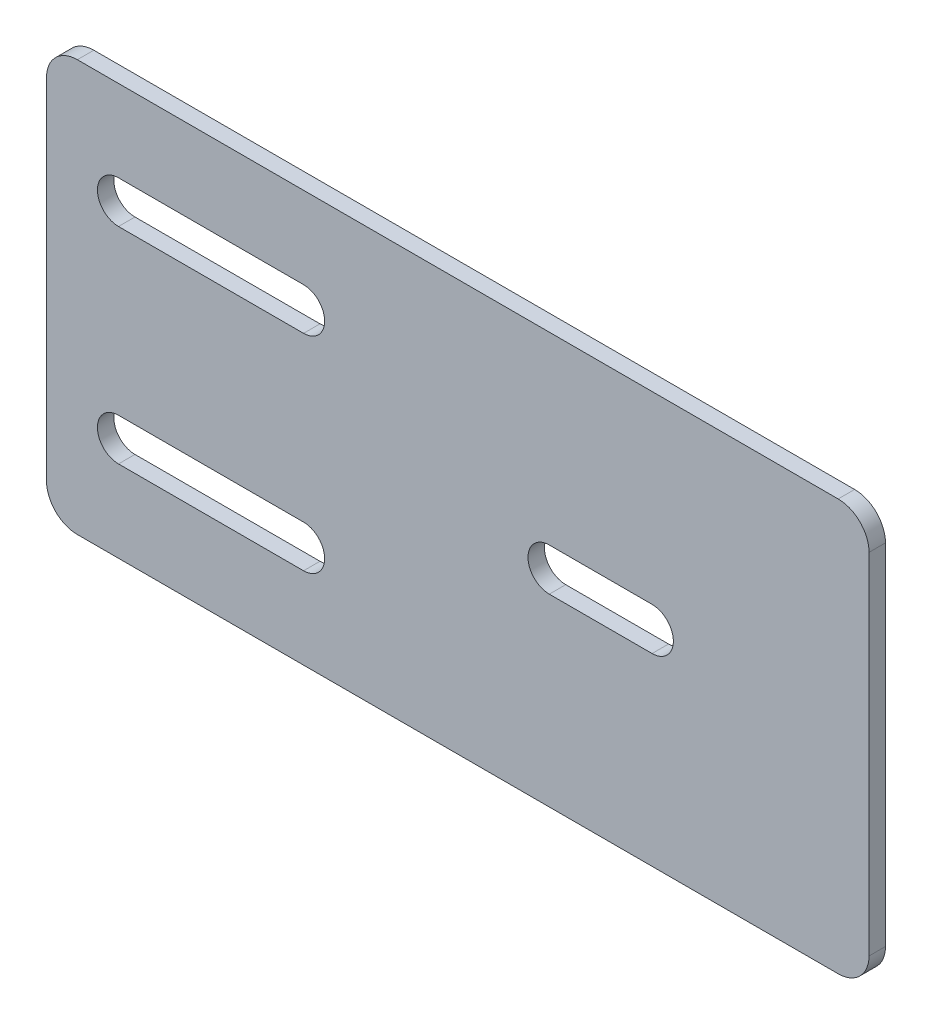
ISO-10303-21;
HEADER;
FILE_DESCRIPTION(('STEP AP214'),'2;1');
FILE_NAME('part.step','',(''),(''),'','','');
FILE_SCHEMA(('AUTOMOTIVE_DESIGN { 1 0 10303 214 1 1 1 1 }'));
ENDSEC;
DATA;
#1=APPLICATION_CONTEXT('core data for automotive mechanical design processes');
#2=APPLICATION_PROTOCOL_DEFINITION('international standard','automotive_design',2000,#1);
#3=PRODUCT_CONTEXT('',#1,'mechanical');
#4=PRODUCT('Part','Part','',(#3));
#5=PRODUCT_RELATED_PRODUCT_CATEGORY('part','',(#4));
#6=PRODUCT_DEFINITION_FORMATION('','',#4);
#7=PRODUCT_DEFINITION_CONTEXT('part definition',#1,'design');
#8=PRODUCT_DEFINITION('design','',#6,#7);
#9=PRODUCT_DEFINITION_SHAPE('','',#8);
#10=(LENGTH_UNIT() NAMED_UNIT(*) SI_UNIT(.MILLI.,.METRE.));
#11=(NAMED_UNIT(*) PLANE_ANGLE_UNIT() SI_UNIT($,.RADIAN.));
#12=(NAMED_UNIT(*) SI_UNIT($,.STERADIAN.) SOLID_ANGLE_UNIT());
#13=UNCERTAINTY_MEASURE_WITH_UNIT(LENGTH_MEASURE(1.E-05),#10,'distance_accuracy_value','');
#14=(GEOMETRIC_REPRESENTATION_CONTEXT(3) GLOBAL_UNCERTAINTY_ASSIGNED_CONTEXT((#13)) GLOBAL_UNIT_ASSIGNED_CONTEXT((#10,
#11,#12)) REPRESENTATION_CONTEXT('',''));
#15=CARTESIAN_POINT('',(0.,0.,0.));
#16=DIRECTION('',(0.,0.,1.));
#17=DIRECTION('',(1.,0.,0.));
#18=AXIS2_PLACEMENT_3D('',#15,#16,#17);
#19=CARTESIAN_POINT('',(0.,0.,1.6));
#20=DIRECTION('',(0.,0.,1.));
#21=DIRECTION('',(1.,0.,0.));
#22=AXIS2_PLACEMENT_3D('',#19,#20,#21);
#23=PLANE('',#22);
#24=DIRECTION('',(1.,0.,0.));
#25=VECTOR('',#24,1.);
#26=CARTESIAN_POINT('',(-40.,-20.,1.6));
#27=LINE('',#26,#25);
#28=CARTESIAN_POINT('',(-37.,-20.,1.6));
#29=VERTEX_POINT('',#28);
#30=CARTESIAN_POINT('',(37.,-20.,1.6));
#31=VERTEX_POINT('',#30);
#32=EDGE_CURVE('E335',#29,#31,#27,.T.);
#33=ORIENTED_EDGE('',*,*,#32,.T.);
#34=CARTESIAN_POINT('',(37.,-17.,1.6));
#35=DIRECTION('',(0.,0.,1.));
#36=DIRECTION('',(1.,0.,0.));
#37=AXIS2_PLACEMENT_3D('',#34,#35,#36);
#38=CIRCLE('',#37,3.);
#39=CARTESIAN_POINT('',(40.,-17.,1.6));
#40=VERTEX_POINT('',#39);
#41=EDGE_CURVE('E328',#31,#40,#38,.T.);
#42=ORIENTED_EDGE('',*,*,#41,.T.);
#43=DIRECTION('',(0.,1.,0.));
#44=VECTOR('',#43,1.);
#45=CARTESIAN_POINT('',(40.,20.,1.6));
#46=LINE('',#45,#44);
#47=CARTESIAN_POINT('',(40.,17.,1.6));
#48=VERTEX_POINT('',#47);
#49=EDGE_CURVE('E304',#40,#48,#46,.T.);
#50=ORIENTED_EDGE('',*,*,#49,.T.);
#51=CARTESIAN_POINT('',(37.,17.,1.6));
#52=DIRECTION('',(0.,0.,1.));
#53=DIRECTION('',(1.,0.,0.));
#54=AXIS2_PLACEMENT_3D('',#51,#52,#53);
#55=CIRCLE('',#54,3.);
#56=CARTESIAN_POINT('',(37.,20.,1.6));
#57=VERTEX_POINT('',#56);
#58=EDGE_CURVE('E320',#48,#57,#55,.T.);
#59=ORIENTED_EDGE('',*,*,#58,.T.);
#60=DIRECTION('',(-1.,0.,0.));
#61=VECTOR('',#60,1.);
#62=CARTESIAN_POINT('',(-40.,20.,1.6));
#63=LINE('',#62,#61);
#64=CARTESIAN_POINT('',(-37.,20.,1.6));
#65=VERTEX_POINT('',#64);
#66=EDGE_CURVE('E308',#57,#65,#63,.T.);
#67=ORIENTED_EDGE('',*,*,#66,.T.);
#68=CARTESIAN_POINT('',(-37.,17.,1.6));
#69=DIRECTION('',(0.,0.,1.));
#70=DIRECTION('',(1.,0.,0.));
#71=AXIS2_PLACEMENT_3D('',#68,#69,#70);
#72=CIRCLE('',#71,3.);
#73=CARTESIAN_POINT('',(-40.,17.,1.6));
#74=VERTEX_POINT('',#73);
#75=EDGE_CURVE('E63',#65,#74,#72,.T.);
#76=ORIENTED_EDGE('',*,*,#75,.T.);
#77=DIRECTION('',(0.,-1.,0.));
#78=VECTOR('',#77,1.);
#79=CARTESIAN_POINT('',(-40.,20.,1.6));
#80=LINE('',#79,#78);
#81=CARTESIAN_POINT('',(-40.,-17.,1.6));
#82=VERTEX_POINT('',#81);
#83=EDGE_CURVE('E332',#74,#82,#80,.T.);
#84=ORIENTED_EDGE('',*,*,#83,.T.);
#85=CARTESIAN_POINT('',(-37.,-17.,1.6));
#86=DIRECTION('',(0.,0.,1.));
#87=DIRECTION('',(1.,0.,0.));
#88=AXIS2_PLACEMENT_3D('',#85,#86,#87);
#89=CIRCLE('',#88,3.);
#90=EDGE_CURVE('E324',#82,#29,#89,.T.);
#91=ORIENTED_EDGE('',*,*,#90,.T.);
#92=EDGE_LOOP('',(#33,#42,#50,#59,#67,#76,#84,#91));
#93=FACE_BOUND('',#92,.T.);
#94=DIRECTION('',(-1.,0.,0.));
#95=VECTOR('',#94,1.);
#96=CARTESIAN_POINT('',(-15.,12.05,1.6));
#97=LINE('',#96,#95);
#98=CARTESIAN_POINT('',(-15.,12.05,1.6));
#99=VERTEX_POINT('',#98);
#100=CARTESIAN_POINT('',(-33.,12.05,1.6));
#101=VERTEX_POINT('',#100);
#102=EDGE_CURVE('E269',#99,#101,#97,.T.);
#103=ORIENTED_EDGE('',*,*,#102,.F.);
#104=CARTESIAN_POINT('',(-15.,10.,1.6));
#105=DIRECTION('',(0.,0.,1.));
#106=DIRECTION('',(1.,0.,0.));
#107=AXIS2_PLACEMENT_3D('',#104,#105,#106);
#108=CIRCLE('',#107,2.05);
#109=CARTESIAN_POINT('',(-15.,7.95,1.6));
#110=VERTEX_POINT('',#109);
#111=EDGE_CURVE('E266',#110,#99,#108,.T.);
#112=ORIENTED_EDGE('',*,*,#111,.F.);
#113=DIRECTION('',(1.,0.,0.));
#114=VECTOR('',#113,1.);
#115=CARTESIAN_POINT('',(-15.,7.95,1.6));
#116=LINE('',#115,#114);
#117=CARTESIAN_POINT('',(-33.,7.95,1.6));
#118=VERTEX_POINT('',#117);
#119=EDGE_CURVE('E278',#118,#110,#116,.T.);
#120=ORIENTED_EDGE('',*,*,#119,.F.);
#121=CARTESIAN_POINT('',(-33.,9.99999999999999,1.6));
#122=DIRECTION('',(0.,0.,1.));
#123=DIRECTION('',(1.,0.,0.));
#124=AXIS2_PLACEMENT_3D('',#121,#122,#123);
#125=CIRCLE('',#124,2.05);
#126=EDGE_CURVE('E282',#101,#118,#125,.T.);
#127=ORIENTED_EDGE('',*,*,#126,.F.);
#128=EDGE_LOOP('',(#103,#112,#120,#127));
#129=FACE_BOUND('',#128,.T.);
#130=DIRECTION('',(-1.,0.,0.));
#131=VECTOR('',#130,1.);
#132=CARTESIAN_POINT('',(-15.,-7.95,1.6));
#133=LINE('',#132,#131);
#134=CARTESIAN_POINT('',(-15.,-7.95,1.6));
#135=VERTEX_POINT('',#134);
#136=CARTESIAN_POINT('',(-33.,-7.95,1.6));
#137=VERTEX_POINT('',#136);
#138=EDGE_CURVE('E233',#135,#137,#133,.T.);
#139=ORIENTED_EDGE('',*,*,#138,.F.);
#140=CARTESIAN_POINT('',(-15.,-10.,1.6));
#141=DIRECTION('',(0.,0.,1.));
#142=DIRECTION('',(-1.,0.,0.));
#143=AXIS2_PLACEMENT_3D('',#140,#141,#142);
#144=CIRCLE('',#143,2.05);
#145=CARTESIAN_POINT('',(-15.,-12.05,1.6));
#146=VERTEX_POINT('',#145);
#147=EDGE_CURVE('E230',#146,#135,#144,.T.);
#148=ORIENTED_EDGE('',*,*,#147,.F.);
#149=DIRECTION('',(1.,0.,0.));
#150=VECTOR('',#149,1.);
#151=CARTESIAN_POINT('',(-15.,-12.05,1.6));
#152=LINE('',#151,#150);
#153=CARTESIAN_POINT('',(-33.,-12.05,1.6));
#154=VERTEX_POINT('',#153);
#155=EDGE_CURVE('E240',#154,#146,#152,.T.);
#156=ORIENTED_EDGE('',*,*,#155,.F.);
#157=CARTESIAN_POINT('',(-33.,-9.99999999999999,1.6));
#158=DIRECTION('',(0.,0.,1.));
#159=DIRECTION('',(-1.,0.,0.));
#160=AXIS2_PLACEMENT_3D('',#157,#158,#159);
#161=CIRCLE('',#160,2.05);
#162=EDGE_CURVE('E244',#137,#154,#161,.T.);
#163=ORIENTED_EDGE('',*,*,#162,.F.);
#164=EDGE_LOOP('',(#139,#148,#156,#163));
#165=FACE_BOUND('',#164,.T.);
#166=DIRECTION('',(1.,0.,0.));
#167=VECTOR('',#166,1.);
#168=CARTESIAN_POINT('',(8.9,-2.07,1.6));
#169=LINE('',#168,#167);
#170=CARTESIAN_POINT('',(8.9,-2.07,1.6));
#171=VERTEX_POINT('',#170);
#172=CARTESIAN_POINT('',(18.9,-2.07,1.6));
#173=VERTEX_POINT('',#172);
#174=EDGE_CURVE('E191',#171,#173,#169,.T.);
#175=ORIENTED_EDGE('',*,*,#174,.F.);
#176=CARTESIAN_POINT('',(8.9,0.,1.6));
#177=DIRECTION('',(0.,0.,1.));
#178=DIRECTION('',(1.,0.,0.));
#179=AXIS2_PLACEMENT_3D('',#176,#177,#178);
#180=CIRCLE('',#179,2.07);
#181=CARTESIAN_POINT('',(8.9,2.07,1.6));
#182=VERTEX_POINT('',#181);
#183=EDGE_CURVE('E181',#182,#171,#180,.T.);
#184=ORIENTED_EDGE('',*,*,#183,.F.);
#185=DIRECTION('',(-1.,0.,0.));
#186=VECTOR('',#185,1.);
#187=CARTESIAN_POINT('',(8.9,2.07,1.6));
#188=LINE('',#187,#186);
#189=CARTESIAN_POINT('',(18.9,2.07,1.6));
#190=VERTEX_POINT('',#189);
#191=EDGE_CURVE('E206',#190,#182,#188,.T.);
#192=ORIENTED_EDGE('',*,*,#191,.F.);
#193=CARTESIAN_POINT('',(18.9,0.,1.6));
#194=DIRECTION('',(0.,0.,1.));
#195=DIRECTION('',(1.,0.,0.));
#196=AXIS2_PLACEMENT_3D('',#193,#194,#195);
#197=CIRCLE('',#196,2.07);
#198=EDGE_CURVE('E204',#173,#190,#197,.T.);
#199=ORIENTED_EDGE('',*,*,#198,.F.);
#200=EDGE_LOOP('',(#175,#184,#192,#199));
#201=FACE_BOUND('',#200,.T.);
#202=ADVANCED_FACE('F41',(#93,#129,#165,#201),#23,.T.);
#203=CARTESIAN_POINT('',(0.,0.,0.));
#204=DIRECTION('',(0.,0.,1.));
#205=DIRECTION('',(1.,0.,0.));
#206=AXIS2_PLACEMENT_3D('',#203,#204,#205);
#207=PLANE('',#206);
#208=CARTESIAN_POINT('',(-15.,-10.,0.));
#209=DIRECTION('',(0.,0.,1.));
#210=DIRECTION('',(-1.,0.,0.));
#211=AXIS2_PLACEMENT_3D('',#208,#209,#210);
#212=CIRCLE('',#211,2.05);
#213=CARTESIAN_POINT('',(-15.,-12.05,0.));
#214=VERTEX_POINT('',#213);
#215=CARTESIAN_POINT('',(-15.,-7.95,0.));
#216=VERTEX_POINT('',#215);
#217=EDGE_CURVE('E199',#214,#216,#212,.T.);
#218=ORIENTED_EDGE('',*,*,#217,.T.);
#219=DIRECTION('',(-1.,0.,0.));
#220=VECTOR('',#219,1.);
#221=CARTESIAN_POINT('',(-15.,-7.95,0.));
#222=LINE('',#221,#220);
#223=CARTESIAN_POINT('',(-33.,-7.95,0.));
#224=VERTEX_POINT('',#223);
#225=EDGE_CURVE('E248',#216,#224,#222,.T.);
#226=ORIENTED_EDGE('',*,*,#225,.T.);
#227=CARTESIAN_POINT('',(-33.,-9.99999999999999,0.));
#228=DIRECTION('',(0.,0.,1.));
#229=DIRECTION('',(-1.,0.,0.));
#230=AXIS2_PLACEMENT_3D('',#227,#228,#229);
#231=CIRCLE('',#230,2.05);
#232=CARTESIAN_POINT('',(-33.,-12.05,0.));
#233=VERTEX_POINT('',#232);
#234=EDGE_CURVE('E251',#224,#233,#231,.T.);
#235=ORIENTED_EDGE('',*,*,#234,.T.);
#236=DIRECTION('',(1.,0.,0.));
#237=VECTOR('',#236,1.);
#238=CARTESIAN_POINT('',(-15.,-12.05,0.));
#239=LINE('',#238,#237);
#240=EDGE_CURVE('E234',#233,#214,#239,.T.);
#241=ORIENTED_EDGE('',*,*,#240,.T.);
#242=EDGE_LOOP('',(#218,#226,#235,#241));
#243=FACE_BOUND('',#242,.T.);
#244=DIRECTION('',(0.,1.,0.));
#245=VECTOR('',#244,1.);
#246=CARTESIAN_POINT('',(40.,20.,0.));
#247=LINE('',#246,#245);
#248=CARTESIAN_POINT('',(40.,-17.,0.));
#249=VERTEX_POINT('',#248);
#250=CARTESIAN_POINT('',(40.,17.,0.));
#251=VERTEX_POINT('',#250);
#252=EDGE_CURVE('E303',#249,#251,#247,.T.);
#253=ORIENTED_EDGE('',*,*,#252,.F.);
#254=CARTESIAN_POINT('',(37.,-17.,0.));
#255=DIRECTION('',(0.,0.,1.));
#256=DIRECTION('',(1.,0.,0.));
#257=AXIS2_PLACEMENT_3D('',#254,#255,#256);
#258=CIRCLE('',#257,3.);
#259=CARTESIAN_POINT('',(37.,-20.,0.));
#260=VERTEX_POINT('',#259);
#261=EDGE_CURVE('E359',#249,#260,#258,.F.);
#262=ORIENTED_EDGE('',*,*,#261,.T.);
#263=DIRECTION('',(1.,0.,0.));
#264=VECTOR('',#263,1.);
#265=CARTESIAN_POINT('',(-40.,-20.,0.));
#266=LINE('',#265,#264);
#267=CARTESIAN_POINT('',(-37.,-20.,0.));
#268=VERTEX_POINT('',#267);
#269=EDGE_CURVE('E309',#268,#260,#266,.T.);
#270=ORIENTED_EDGE('',*,*,#269,.F.);
#271=CARTESIAN_POINT('',(-37.,-17.,0.));
#272=DIRECTION('',(0.,0.,1.));
#273=DIRECTION('',(1.,0.,0.));
#274=AXIS2_PLACEMENT_3D('',#271,#272,#273);
#275=CIRCLE('',#274,3.);
#276=CARTESIAN_POINT('',(-40.,-17.,0.));
#277=VERTEX_POINT('',#276);
#278=EDGE_CURVE('E357',#268,#277,#275,.F.);
#279=ORIENTED_EDGE('',*,*,#278,.T.);
#280=DIRECTION('',(0.,-1.,0.));
#281=VECTOR('',#280,1.);
#282=CARTESIAN_POINT('',(-40.,20.,0.));
#283=LINE('',#282,#281);
#284=CARTESIAN_POINT('',(-40.,17.,0.));
#285=VERTEX_POINT('',#284);
#286=EDGE_CURVE('E345',#285,#277,#283,.T.);
#287=ORIENTED_EDGE('',*,*,#286,.F.);
#288=CARTESIAN_POINT('',(-37.,17.,0.));
#289=DIRECTION('',(0.,0.,1.));
#290=DIRECTION('',(1.,0.,0.));
#291=AXIS2_PLACEMENT_3D('',#288,#289,#290);
#292=CIRCLE('',#291,3.);
#293=CARTESIAN_POINT('',(-37.,20.,0.));
#294=VERTEX_POINT('',#293);
#295=EDGE_CURVE('E353',#285,#294,#292,.F.);
#296=ORIENTED_EDGE('',*,*,#295,.T.);
#297=DIRECTION('',(-1.,0.,0.));
#298=VECTOR('',#297,1.);
#299=CARTESIAN_POINT('',(-40.,20.,0.));
#300=LINE('',#299,#298);
#301=CARTESIAN_POINT('',(37.,20.,0.));
#302=VERTEX_POINT('',#301);
#303=EDGE_CURVE('E342',#302,#294,#300,.T.);
#304=ORIENTED_EDGE('',*,*,#303,.F.);
#305=CARTESIAN_POINT('',(37.,17.,0.));
#306=DIRECTION('',(0.,0.,1.));
#307=DIRECTION('',(1.,0.,0.));
#308=AXIS2_PLACEMENT_3D('',#305,#306,#307);
#309=CIRCLE('',#308,3.);
#310=EDGE_CURVE('E355',#302,#251,#309,.F.);
#311=ORIENTED_EDGE('',*,*,#310,.T.);
#312=EDGE_LOOP('',(#253,#262,#270,#279,#287,#296,#304,#311));
#313=FACE_BOUND('',#312,.T.);
#314=CARTESIAN_POINT('',(-15.,10.,0.));
#315=DIRECTION('',(0.,0.,1.));
#316=DIRECTION('',(1.,0.,0.));
#317=AXIS2_PLACEMENT_3D('',#314,#315,#316);
#318=CIRCLE('',#317,2.05);
#319=CARTESIAN_POINT('',(-15.,7.95,0.));
#320=VERTEX_POINT('',#319);
#321=CARTESIAN_POINT('',(-15.,12.05,0.));
#322=VERTEX_POINT('',#321);
#323=EDGE_CURVE('E265',#320,#322,#318,.T.);
#324=ORIENTED_EDGE('',*,*,#323,.T.);
#325=DIRECTION('',(-1.,0.,0.));
#326=VECTOR('',#325,1.);
#327=CARTESIAN_POINT('',(-15.,12.05,0.));
#328=LINE('',#327,#326);
#329=CARTESIAN_POINT('',(-33.,12.05,0.));
#330=VERTEX_POINT('',#329);
#331=EDGE_CURVE('E286',#322,#330,#328,.T.);
#332=ORIENTED_EDGE('',*,*,#331,.T.);
#333=CARTESIAN_POINT('',(-33.,9.99999999999999,0.));
#334=DIRECTION('',(0.,0.,1.));
#335=DIRECTION('',(1.,0.,0.));
#336=AXIS2_PLACEMENT_3D('',#333,#334,#335);
#337=CIRCLE('',#336,2.05);
#338=CARTESIAN_POINT('',(-33.,7.95,0.));
#339=VERTEX_POINT('',#338);
#340=EDGE_CURVE('E289',#330,#339,#337,.T.);
#341=ORIENTED_EDGE('',*,*,#340,.T.);
#342=DIRECTION('',(1.,0.,0.));
#343=VECTOR('',#342,1.);
#344=CARTESIAN_POINT('',(-15.,7.95,0.));
#345=LINE('',#344,#343);
#346=EDGE_CURVE('E270',#339,#320,#345,.T.);
#347=ORIENTED_EDGE('',*,*,#346,.T.);
#348=EDGE_LOOP('',(#324,#332,#341,#347));
#349=FACE_BOUND('',#348,.T.);
#350=CARTESIAN_POINT('',(8.9,0.,0.));
#351=DIRECTION('',(0.,0.,1.));
#352=DIRECTION('',(1.,0.,0.));
#353=AXIS2_PLACEMENT_3D('',#350,#351,#352);
#354=CIRCLE('',#353,2.07);
#355=CARTESIAN_POINT('',(8.9,2.07,0.));
#356=VERTEX_POINT('',#355);
#357=CARTESIAN_POINT('',(8.9,-2.07,0.));
#358=VERTEX_POINT('',#357);
#359=EDGE_CURVE('E218',#356,#358,#354,.T.);
#360=ORIENTED_EDGE('',*,*,#359,.T.);
#361=DIRECTION('',(1.,0.,0.));
#362=VECTOR('',#361,1.);
#363=CARTESIAN_POINT('',(8.9,-2.07,0.));
#364=LINE('',#363,#362);
#365=CARTESIAN_POINT('',(18.9,-2.07,0.));
#366=VERTEX_POINT('',#365);
#367=EDGE_CURVE('E198',#358,#366,#364,.T.);
#368=ORIENTED_EDGE('',*,*,#367,.T.);
#369=CARTESIAN_POINT('',(18.9,0.,0.));
#370=DIRECTION('',(0.,0.,1.));
#371=DIRECTION('',(1.,0.,0.));
#372=AXIS2_PLACEMENT_3D('',#369,#370,#371);
#373=CIRCLE('',#372,2.07);
#374=CARTESIAN_POINT('',(18.9,2.07,0.));
#375=VERTEX_POINT('',#374);
#376=EDGE_CURVE('E221',#366,#375,#373,.T.);
#377=ORIENTED_EDGE('',*,*,#376,.T.);
#378=DIRECTION('',(-1.,0.,0.));
#379=VECTOR('',#378,1.);
#380=CARTESIAN_POINT('',(8.9,2.07,0.));
#381=LINE('',#380,#379);
#382=EDGE_CURVE('E192',#375,#356,#381,.T.);
#383=ORIENTED_EDGE('',*,*,#382,.T.);
#384=EDGE_LOOP('',(#360,#368,#377,#383));
#385=FACE_BOUND('',#384,.T.);
#386=ADVANCED_FACE('F392',(#243,#313,#349,#385),#207,.F.);
#387=CARTESIAN_POINT('',(40.,20.,1.6));
#388=DIRECTION('',(-1.,0.,0.));
#389=DIRECTION('',(0.,0.,1.));
#390=AXIS2_PLACEMENT_3D('',#387,#388,#389);
#391=PLANE('',#390);
#392=ORIENTED_EDGE('',*,*,#49,.F.);
#393=DIRECTION('',(0.,0.,-1.));
#394=VECTOR('',#393,1.);
#395=CARTESIAN_POINT('',(40.,-17.,1.6));
#396=LINE('',#395,#394);
#397=EDGE_CURVE('E350',#40,#249,#396,.T.);
#398=ORIENTED_EDGE('',*,*,#397,.T.);
#399=ORIENTED_EDGE('',*,*,#252,.T.);
#400=DIRECTION('',(0.,0.,-1.));
#401=VECTOR('',#400,1.);
#402=CARTESIAN_POINT('',(40.,17.,1.6));
#403=LINE('',#402,#401);
#404=EDGE_CURVE('E339',#251,#48,#403,.F.);
#405=ORIENTED_EDGE('',*,*,#404,.T.);
#406=EDGE_LOOP('',(#392,#398,#399,#405));
#407=FACE_BOUND('',#406,.T.);
#408=ADVANCED_FACE('F398',(#407),#391,.F.);
#409=CARTESIAN_POINT('',(-40.,20.,1.6));
#410=DIRECTION('',(0.,-1.,0.));
#411=DIRECTION('',(0.,0.,-1.));
#412=AXIS2_PLACEMENT_3D('',#409,#410,#411);
#413=PLANE('',#412);
#414=ORIENTED_EDGE('',*,*,#66,.F.);
#415=DIRECTION('',(0.,0.,-1.));
#416=VECTOR('',#415,1.);
#417=CARTESIAN_POINT('',(37.,20.,1.6));
#418=LINE('',#417,#416);
#419=EDGE_CURVE('E12',#57,#302,#418,.T.);
#420=ORIENTED_EDGE('',*,*,#419,.T.);
#421=ORIENTED_EDGE('',*,*,#303,.T.);
#422=DIRECTION('',(0.,0.,-1.));
#423=VECTOR('',#422,1.);
#424=CARTESIAN_POINT('',(-37.,20.,1.6));
#425=LINE('',#424,#423);
#426=EDGE_CURVE('E49',#294,#65,#425,.F.);
#427=ORIENTED_EDGE('',*,*,#426,.T.);
#428=EDGE_LOOP('',(#414,#420,#421,#427));
#429=FACE_BOUND('',#428,.T.);
#430=ADVANCED_FACE('F385',(#429),#413,.F.);
#431=CARTESIAN_POINT('',(-40.,20.,1.6));
#432=DIRECTION('',(1.,0.,0.));
#433=DIRECTION('',(0.,0.,-1.));
#434=AXIS2_PLACEMENT_3D('',#431,#432,#433);
#435=PLANE('',#434);
#436=ORIENTED_EDGE('',*,*,#286,.T.);
#437=DIRECTION('',(0.,0.,-1.));
#438=VECTOR('',#437,1.);
#439=CARTESIAN_POINT('',(-40.,-17.,1.6));
#440=LINE('',#439,#438);
#441=EDGE_CURVE('E56',#277,#82,#440,.F.);
#442=ORIENTED_EDGE('',*,*,#441,.T.);
#443=ORIENTED_EDGE('',*,*,#83,.F.);
#444=DIRECTION('',(0.,0.,-1.));
#445=VECTOR('',#444,1.);
#446=CARTESIAN_POINT('',(-40.,17.,1.6));
#447=LINE('',#446,#445);
#448=EDGE_CURVE('E377',#74,#285,#447,.T.);
#449=ORIENTED_EDGE('',*,*,#448,.T.);
#450=EDGE_LOOP('',(#436,#442,#443,#449));
#451=FACE_BOUND('',#450,.T.);
#452=ADVANCED_FACE('F394',(#451),#435,.F.);
#453=CARTESIAN_POINT('',(-40.,-20.,1.6));
#454=DIRECTION('',(0.,1.,0.));
#455=DIRECTION('',(0.,0.,1.));
#456=AXIS2_PLACEMENT_3D('',#453,#454,#455);
#457=PLANE('',#456);
#458=ORIENTED_EDGE('',*,*,#269,.T.);
#459=DIRECTION('',(0.,0.,-1.));
#460=VECTOR('',#459,1.);
#461=CARTESIAN_POINT('',(37.,-20.,1.6));
#462=LINE('',#461,#460);
#463=EDGE_CURVE('E363',#260,#31,#462,.F.);
#464=ORIENTED_EDGE('',*,*,#463,.T.);
#465=ORIENTED_EDGE('',*,*,#32,.F.);
#466=DIRECTION('',(0.,0.,-1.));
#467=VECTOR('',#466,1.);
#468=CARTESIAN_POINT('',(-37.,-20.,1.6));
#469=LINE('',#468,#467);
#470=EDGE_CURVE('E361',#29,#268,#469,.T.);
#471=ORIENTED_EDGE('',*,*,#470,.T.);
#472=EDGE_LOOP('',(#458,#464,#465,#471));
#473=FACE_BOUND('',#472,.T.);
#474=ADVANCED_FACE('F367',(#473),#457,.F.);
#475=CARTESIAN_POINT('',(-15.,10.,1.6));
#476=DIRECTION('',(0.,0.,-1.));
#477=DIRECTION('',(-1.,0.,0.));
#478=AXIS2_PLACEMENT_3D('',#475,#476,#477);
#479=CYLINDRICAL_SURFACE('',#478,2.05);
#480=ORIENTED_EDGE('',*,*,#323,.F.);
#481=DIRECTION('',(0.,0.,-1.));
#482=VECTOR('',#481,1.);
#483=CARTESIAN_POINT('',(-15.,7.95,1.6));
#484=LINE('',#483,#482);
#485=EDGE_CURVE('E281',#110,#320,#484,.T.);
#486=ORIENTED_EDGE('',*,*,#485,.F.);
#487=ORIENTED_EDGE('',*,*,#111,.T.);
#488=DIRECTION('',(0.,0.,-1.));
#489=VECTOR('',#488,1.);
#490=CARTESIAN_POINT('',(-15.,12.05,1.6));
#491=LINE('',#490,#489);
#492=EDGE_CURVE('E300',#99,#322,#491,.T.);
#493=ORIENTED_EDGE('',*,*,#492,.T.);
#494=EDGE_LOOP('',(#480,#486,#487,#493));
#495=FACE_BOUND('',#494,.T.);
#496=ADVANCED_FACE('F417',(#495),#479,.F.);
#497=CARTESIAN_POINT('',(-15.,12.05,1.6));
#498=DIRECTION('',(0.,-1.,0.));
#499=DIRECTION('',(1.,0.,0.));
#500=AXIS2_PLACEMENT_3D('',#497,#498,#499);
#501=PLANE('',#500);
#502=ORIENTED_EDGE('',*,*,#331,.F.);
#503=ORIENTED_EDGE('',*,*,#492,.F.);
#504=ORIENTED_EDGE('',*,*,#102,.T.);
#505=DIRECTION('',(0.,0.,-1.));
#506=VECTOR('',#505,1.);
#507=CARTESIAN_POINT('',(-33.,12.05,1.6));
#508=LINE('',#507,#506);
#509=EDGE_CURVE('E298',#101,#330,#508,.T.);
#510=ORIENTED_EDGE('',*,*,#509,.T.);
#511=EDGE_LOOP('',(#502,#503,#504,#510));
#512=FACE_BOUND('',#511,.T.);
#513=ADVANCED_FACE('F468',(#512),#501,.T.);
#514=CARTESIAN_POINT('',(-33.,9.99999999999999,1.6));
#515=DIRECTION('',(0.,0.,-1.));
#516=DIRECTION('',(-1.,0.,0.));
#517=AXIS2_PLACEMENT_3D('',#514,#515,#516);
#518=CYLINDRICAL_SURFACE('',#517,2.05);
#519=ORIENTED_EDGE('',*,*,#340,.F.);
#520=ORIENTED_EDGE('',*,*,#509,.F.);
#521=ORIENTED_EDGE('',*,*,#126,.T.);
#522=DIRECTION('',(0.,0.,-1.));
#523=VECTOR('',#522,1.);
#524=CARTESIAN_POINT('',(-33.,7.95,1.6));
#525=LINE('',#524,#523);
#526=EDGE_CURVE('E296',#118,#339,#525,.T.);
#527=ORIENTED_EDGE('',*,*,#526,.T.);
#528=EDGE_LOOP('',(#519,#520,#521,#527));
#529=FACE_BOUND('',#528,.T.);
#530=ADVANCED_FACE('F465',(#529),#518,.F.);
#531=CARTESIAN_POINT('',(-15.,7.95,1.6));
#532=DIRECTION('',(0.,1.,0.));
#533=DIRECTION('',(0.,0.,1.));
#534=AXIS2_PLACEMENT_3D('',#531,#532,#533);
#535=PLANE('',#534);
#536=ORIENTED_EDGE('',*,*,#346,.F.);
#537=ORIENTED_EDGE('',*,*,#526,.F.);
#538=ORIENTED_EDGE('',*,*,#119,.T.);
#539=ORIENTED_EDGE('',*,*,#485,.T.);
#540=EDGE_LOOP('',(#536,#537,#538,#539));
#541=FACE_BOUND('',#540,.T.);
#542=ADVANCED_FACE('F461',(#541),#535,.T.);
#543=CARTESIAN_POINT('',(-15.,-10.,1.6));
#544=DIRECTION('',(0.,0.,-1.));
#545=DIRECTION('',(-1.,0.,0.));
#546=AXIS2_PLACEMENT_3D('',#543,#544,#545);
#547=CYLINDRICAL_SURFACE('',#546,2.05);
#548=ORIENTED_EDGE('',*,*,#217,.F.);
#549=DIRECTION('',(0.,0.,-1.));
#550=VECTOR('',#549,1.);
#551=CARTESIAN_POINT('',(-15.,-12.05,1.6));
#552=LINE('',#551,#550);
#553=EDGE_CURVE('E243',#146,#214,#552,.T.);
#554=ORIENTED_EDGE('',*,*,#553,.F.);
#555=ORIENTED_EDGE('',*,*,#147,.T.);
#556=DIRECTION('',(0.,0.,-1.));
#557=VECTOR('',#556,1.);
#558=CARTESIAN_POINT('',(-15.,-7.95,1.6));
#559=LINE('',#558,#557);
#560=EDGE_CURVE('E262',#135,#216,#559,.T.);
#561=ORIENTED_EDGE('',*,*,#560,.T.);
#562=EDGE_LOOP('',(#548,#554,#555,#561));
#563=FACE_BOUND('',#562,.T.);
#564=ADVANCED_FACE('F457',(#563),#547,.F.);
#565=CARTESIAN_POINT('',(-15.,-7.95,1.6));
#566=DIRECTION('',(0.,-1.,0.));
#567=DIRECTION('',(0.,0.,-1.));
#568=AXIS2_PLACEMENT_3D('',#565,#566,#567);
#569=PLANE('',#568);
#570=ORIENTED_EDGE('',*,*,#225,.F.);
#571=ORIENTED_EDGE('',*,*,#560,.F.);
#572=ORIENTED_EDGE('',*,*,#138,.T.);
#573=DIRECTION('',(0.,0.,-1.));
#574=VECTOR('',#573,1.);
#575=CARTESIAN_POINT('',(-33.,-7.95,1.6));
#576=LINE('',#575,#574);
#577=EDGE_CURVE('E260',#137,#224,#576,.T.);
#578=ORIENTED_EDGE('',*,*,#577,.T.);
#579=EDGE_LOOP('',(#570,#571,#572,#578));
#580=FACE_BOUND('',#579,.T.);
#581=ADVANCED_FACE('F453',(#580),#569,.T.);
#582=CARTESIAN_POINT('',(-33.,-9.99999999999999,1.6));
#583=DIRECTION('',(0.,0.,-1.));
#584=DIRECTION('',(-1.,0.,0.));
#585=AXIS2_PLACEMENT_3D('',#582,#583,#584);
#586=CYLINDRICAL_SURFACE('',#585,2.05);
#587=ORIENTED_EDGE('',*,*,#234,.F.);
#588=ORIENTED_EDGE('',*,*,#577,.F.);
#589=ORIENTED_EDGE('',*,*,#162,.T.);
#590=DIRECTION('',(0.,0.,-1.));
#591=VECTOR('',#590,1.);
#592=CARTESIAN_POINT('',(-33.,-12.05,1.6));
#593=LINE('',#592,#591);
#594=EDGE_CURVE('E258',#154,#233,#593,.T.);
#595=ORIENTED_EDGE('',*,*,#594,.T.);
#596=EDGE_LOOP('',(#587,#588,#589,#595));
#597=FACE_BOUND('',#596,.T.);
#598=ADVANCED_FACE('F449',(#597),#586,.F.);
#599=CARTESIAN_POINT('',(-15.,-12.05,1.6));
#600=DIRECTION('',(0.,1.,0.));
#601=DIRECTION('',(-1.,0.,0.));
#602=AXIS2_PLACEMENT_3D('',#599,#600,#601);
#603=PLANE('',#602);
#604=ORIENTED_EDGE('',*,*,#240,.F.);
#605=ORIENTED_EDGE('',*,*,#594,.F.);
#606=ORIENTED_EDGE('',*,*,#155,.T.);
#607=ORIENTED_EDGE('',*,*,#553,.T.);
#608=EDGE_LOOP('',(#604,#605,#606,#607));
#609=FACE_BOUND('',#608,.T.);
#610=ADVANCED_FACE('F446',(#609),#603,.T.);
#611=CARTESIAN_POINT('',(8.9,0.,1.6));
#612=DIRECTION('',(0.,0.,-1.));
#613=DIRECTION('',(-1.,0.,0.));
#614=AXIS2_PLACEMENT_3D('',#611,#612,#613);
#615=CYLINDRICAL_SURFACE('',#614,2.07);
#616=ORIENTED_EDGE('',*,*,#359,.F.);
#617=DIRECTION('',(0.,0.,-1.));
#618=VECTOR('',#617,1.);
#619=CARTESIAN_POINT('',(8.9,2.07,1.6));
#620=LINE('',#619,#618);
#621=EDGE_CURVE('E187',#182,#356,#620,.T.);
#622=ORIENTED_EDGE('',*,*,#621,.F.);
#623=ORIENTED_EDGE('',*,*,#183,.T.);
#624=DIRECTION('',(0.,0.,-1.));
#625=VECTOR('',#624,1.);
#626=CARTESIAN_POINT('',(8.9,-2.07,1.6));
#627=LINE('',#626,#625);
#628=EDGE_CURVE('E184',#171,#358,#627,.T.);
#629=ORIENTED_EDGE('',*,*,#628,.T.);
#630=EDGE_LOOP('',(#616,#622,#623,#629));
#631=FACE_BOUND('',#630,.T.);
#632=ADVANCED_FACE('F183',(#631),#615,.F.);
#633=CARTESIAN_POINT('',(8.9,-2.07,1.6));
#634=DIRECTION('',(0.,1.,0.));
#635=DIRECTION('',(0.,0.,1.));
#636=AXIS2_PLACEMENT_3D('',#633,#634,#635);
#637=PLANE('',#636);
#638=ORIENTED_EDGE('',*,*,#367,.F.);
#639=ORIENTED_EDGE('',*,*,#628,.F.);
#640=ORIENTED_EDGE('',*,*,#174,.T.);
#641=DIRECTION('',(0.,0.,-1.));
#642=VECTOR('',#641,1.);
#643=CARTESIAN_POINT('',(18.9,-2.07,1.6));
#644=LINE('',#643,#642);
#645=EDGE_CURVE('E200',#173,#366,#644,.T.);
#646=ORIENTED_EDGE('',*,*,#645,.T.);
#647=EDGE_LOOP('',(#638,#639,#640,#646));
#648=FACE_BOUND('',#647,.T.);
#649=ADVANCED_FACE('F195',(#648),#637,.T.);
#650=CARTESIAN_POINT('',(18.9,0.,1.6));
#651=DIRECTION('',(0.,0.,-1.));
#652=DIRECTION('',(-1.,0.,0.));
#653=AXIS2_PLACEMENT_3D('',#650,#651,#652);
#654=CYLINDRICAL_SURFACE('',#653,2.07);
#655=ORIENTED_EDGE('',*,*,#376,.F.);
#656=ORIENTED_EDGE('',*,*,#645,.F.);
#657=ORIENTED_EDGE('',*,*,#198,.T.);
#658=DIRECTION('',(0.,0.,-1.));
#659=VECTOR('',#658,1.);
#660=CARTESIAN_POINT('',(18.9,2.07,1.6));
#661=LINE('',#660,#659);
#662=EDGE_CURVE('E227',#190,#375,#661,.T.);
#663=ORIENTED_EDGE('',*,*,#662,.T.);
#664=EDGE_LOOP('',(#655,#656,#657,#663));
#665=FACE_BOUND('',#664,.T.);
#666=ADVANCED_FACE('F433',(#665),#654,.F.);
#667=CARTESIAN_POINT('',(8.9,2.07,1.6));
#668=DIRECTION('',(0.,-1.,0.));
#669=DIRECTION('',(0.,0.,-1.));
#670=AXIS2_PLACEMENT_3D('',#667,#668,#669);
#671=PLANE('',#670);
#672=ORIENTED_EDGE('',*,*,#382,.F.);
#673=ORIENTED_EDGE('',*,*,#662,.F.);
#674=ORIENTED_EDGE('',*,*,#191,.T.);
#675=ORIENTED_EDGE('',*,*,#621,.T.);
#676=EDGE_LOOP('',(#672,#673,#674,#675));
#677=FACE_BOUND('',#676,.T.);
#678=ADVANCED_FACE('F429',(#677),#671,.T.);
#679=CARTESIAN_POINT('',(37.,-17.,1.6));
#680=DIRECTION('',(0.,0.,-1.));
#681=DIRECTION('',(-1.,0.,0.));
#682=AXIS2_PLACEMENT_3D('',#679,#680,#681);
#683=CYLINDRICAL_SURFACE('',#682,3.);
#684=ORIENTED_EDGE('',*,*,#41,.F.);
#685=ORIENTED_EDGE('',*,*,#463,.F.);
#686=ORIENTED_EDGE('',*,*,#261,.F.);
#687=ORIENTED_EDGE('',*,*,#397,.F.);
#688=EDGE_LOOP('',(#684,#685,#686,#687));
#689=FACE_BOUND('',#688,.T.);
#690=ADVANCED_FACE('F376',(#689),#683,.T.);
#691=CARTESIAN_POINT('',(-37.,-17.,1.6));
#692=DIRECTION('',(0.,0.,-1.));
#693=DIRECTION('',(-1.,0.,0.));
#694=AXIS2_PLACEMENT_3D('',#691,#692,#693);
#695=CYLINDRICAL_SURFACE('',#694,3.);
#696=ORIENTED_EDGE('',*,*,#90,.F.);
#697=ORIENTED_EDGE('',*,*,#441,.F.);
#698=ORIENTED_EDGE('',*,*,#278,.F.);
#699=ORIENTED_EDGE('',*,*,#470,.F.);
#700=EDGE_LOOP('',(#696,#697,#698,#699));
#701=FACE_BOUND('',#700,.T.);
#702=ADVANCED_FACE('F396',(#701),#695,.T.);
#703=CARTESIAN_POINT('',(37.,17.,1.6));
#704=DIRECTION('',(0.,0.,-1.));
#705=DIRECTION('',(-1.,0.,0.));
#706=AXIS2_PLACEMENT_3D('',#703,#704,#705);
#707=CYLINDRICAL_SURFACE('',#706,3.);
#708=ORIENTED_EDGE('',*,*,#58,.F.);
#709=ORIENTED_EDGE('',*,*,#404,.F.);
#710=ORIENTED_EDGE('',*,*,#310,.F.);
#711=ORIENTED_EDGE('',*,*,#419,.F.);
#712=EDGE_LOOP('',(#708,#709,#710,#711));
#713=FACE_BOUND('',#712,.T.);
#714=ADVANCED_FACE('F401',(#713),#707,.T.);
#715=CARTESIAN_POINT('',(-37.,17.,1.6));
#716=DIRECTION('',(0.,0.,-1.));
#717=DIRECTION('',(-1.,0.,0.));
#718=AXIS2_PLACEMENT_3D('',#715,#716,#717);
#719=CYLINDRICAL_SURFACE('',#718,3.);
#720=ORIENTED_EDGE('',*,*,#75,.F.);
#721=ORIENTED_EDGE('',*,*,#426,.F.);
#722=ORIENTED_EDGE('',*,*,#295,.F.);
#723=ORIENTED_EDGE('',*,*,#448,.F.);
#724=EDGE_LOOP('',(#720,#721,#722,#723));
#725=FACE_BOUND('',#724,.T.);
#726=ADVANCED_FACE('F43',(#725),#719,.T.);
#727=CLOSED_SHELL('',(#202,#386,#408,#430,#452,#474,#496,#513,#530,#542,#564,#581,#598,#610,
#632,#649,#666,#678,#690,#702,#714,#726));
#728=MANIFOLD_SOLID_BREP('B2',#727);
#729=ADVANCED_BREP_SHAPE_REPRESENTATION('',(#18,#728),#14);
#730=SHAPE_DEFINITION_REPRESENTATION(#9,#729);
ENDSEC;
END-ISO-10303-21;
